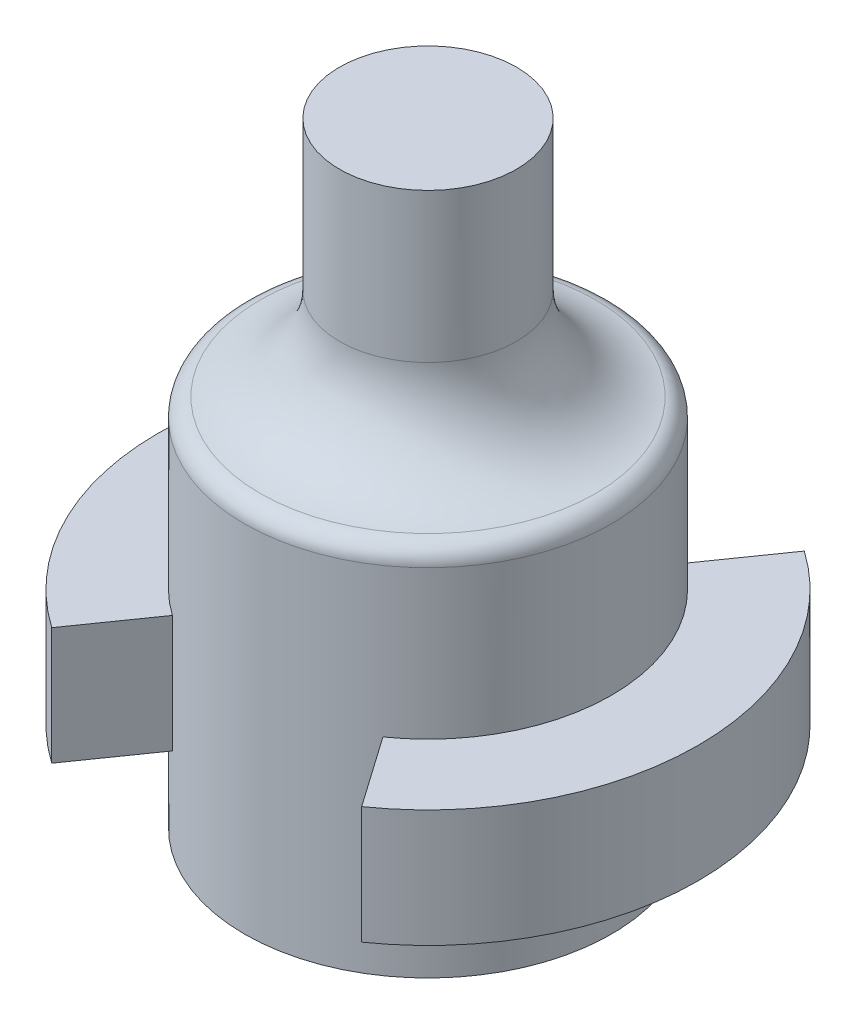
ISO-10303-21;
HEADER;
FILE_DESCRIPTION(('STEP AP214'),'2;1');
FILE_NAME('part.step','',(''),(''),'','','');
FILE_SCHEMA(('AUTOMOTIVE_DESIGN { 1 0 10303 214 1 1 1 1 }'));
ENDSEC;
DATA;
#1=APPLICATION_CONTEXT('core data for automotive mechanical design processes');
#2=APPLICATION_PROTOCOL_DEFINITION('international standard','automotive_design',2000,#1);
#3=PRODUCT_CONTEXT('',#1,'mechanical');
#4=PRODUCT('Part','Part','',(#3));
#5=PRODUCT_RELATED_PRODUCT_CATEGORY('part','',(#4));
#6=PRODUCT_DEFINITION_FORMATION('','',#4);
#7=PRODUCT_DEFINITION_CONTEXT('part definition',#1,'design');
#8=PRODUCT_DEFINITION('design','',#6,#7);
#9=PRODUCT_DEFINITION_SHAPE('','',#8);
#10=(LENGTH_UNIT() NAMED_UNIT(*) SI_UNIT(.MILLI.,.METRE.));
#11=(NAMED_UNIT(*) PLANE_ANGLE_UNIT() SI_UNIT($,.RADIAN.));
#12=(NAMED_UNIT(*) SI_UNIT($,.STERADIAN.) SOLID_ANGLE_UNIT());
#13=UNCERTAINTY_MEASURE_WITH_UNIT(LENGTH_MEASURE(1.E-05),#10,'distance_accuracy_value','');
#14=(GEOMETRIC_REPRESENTATION_CONTEXT(3) GLOBAL_UNCERTAINTY_ASSIGNED_CONTEXT((#13)) GLOBAL_UNIT_ASSIGNED_CONTEXT((#10,
#11,#12)) REPRESENTATION_CONTEXT('',''));
#15=CARTESIAN_POINT('',(0.,0.,0.));
#16=DIRECTION('',(0.,0.,1.));
#17=DIRECTION('',(1.,0.,0.));
#18=AXIS2_PLACEMENT_3D('',#15,#16,#17);
#19=CARTESIAN_POINT('',(0.,3.55,0.));
#20=DIRECTION('',(-0.819152044288995,0.,0.573576436351042));
#21=DIRECTION('',(0.573576436351042,0.,0.819152044288995));
#22=AXIS2_PLACEMENT_3D('',#19,#20,#21);
#23=PLANE('',#22);
#24=DIRECTION('',(-0.573576436351042,0.,-0.819152044288995));
#25=VECTOR('',#24,1.);
#26=CARTESIAN_POINT('',(0.,0.4,0.));
#27=LINE('',#26,#25);
#28=CARTESIAN_POINT('',(-2.82486394902888,0.4,-4.0343238181233));
#29=VERTEX_POINT('',#28);
#30=CARTESIAN_POINT('',(-4.15842916354505,0.4,-5.93885232109521));
#31=VERTEX_POINT('',#30);
#32=EDGE_CURVE('E126',#29,#31,#27,.T.);
#33=ORIENTED_EDGE('',*,*,#32,.T.);
#34=DIRECTION('',(0.,-1.,0.));
#35=VECTOR('',#34,1.);
#36=CARTESIAN_POINT('',(-4.15842916354505,3.55,-5.93885232109521));
#37=LINE('',#36,#35);
#38=CARTESIAN_POINT('',(-4.15842916354505,3.55,-5.93885232109521));
#39=VERTEX_POINT('',#38);
#40=EDGE_CURVE('E160',#39,#31,#37,.T.);
#41=ORIENTED_EDGE('',*,*,#40,.F.);
#42=DIRECTION('',(-0.573576436351042,0.,-0.819152044288995));
#43=VECTOR('',#42,1.);
#44=CARTESIAN_POINT('',(0.,3.55,0.));
#45=LINE('',#44,#43);
#46=CARTESIAN_POINT('',(-2.82486394902888,3.55,-4.0343238181233));
#47=VERTEX_POINT('',#46);
#48=EDGE_CURVE('E135',#47,#39,#45,.T.);
#49=ORIENTED_EDGE('',*,*,#48,.F.);
#50=DIRECTION('',(0.,-1.,0.));
#51=VECTOR('',#50,1.);
#52=CARTESIAN_POINT('',(-2.82486394902888,3.55,-4.0343238181233));
#53=LINE('',#52,#51);
#54=EDGE_CURVE('E145',#47,#29,#53,.T.);
#55=ORIENTED_EDGE('',*,*,#54,.T.);
#56=EDGE_LOOP('',(#33,#41,#49,#55));
#57=FACE_BOUND('',#56,.T.);
#58=ADVANCED_FACE('F41',(#57),#23,.F.);
#59=CARTESIAN_POINT('',(0.,3.55,0.));
#60=DIRECTION('',(0.,-1.,0.));
#61=DIRECTION('',(0.,0.,-1.));
#62=AXIS2_PLACEMENT_3D('',#59,#60,#61);
#63=CYLINDRICAL_SURFACE('',#62,7.25);
#64=CARTESIAN_POINT('',(0.,0.4,0.));
#65=DIRECTION('',(0.,1.,0.));
#66=DIRECTION('',(0.,0.,1.));
#67=AXIS2_PLACEMENT_3D('',#64,#65,#66);
#68=CIRCLE('',#67,7.25);
#69=CARTESIAN_POINT('',(-4.15842916354509,0.4,5.93885232109518));
#70=VERTEX_POINT('',#69);
#71=EDGE_CURVE('E129',#31,#70,#68,.T.);
#72=ORIENTED_EDGE('',*,*,#71,.T.);
#73=DIRECTION('',(0.,-1.,0.));
#74=VECTOR('',#73,1.);
#75=CARTESIAN_POINT('',(-4.15842916354509,3.55,5.93885232109518));
#76=LINE('',#75,#74);
#77=CARTESIAN_POINT('',(-4.15842916354509,3.55,5.93885232109518));
#78=VERTEX_POINT('',#77);
#79=EDGE_CURVE('E158',#78,#70,#76,.T.);
#80=ORIENTED_EDGE('',*,*,#79,.F.);
#81=CARTESIAN_POINT('',(0.,3.55,0.));
#82=DIRECTION('',(0.,1.,0.));
#83=DIRECTION('',(0.,0.,1.));
#84=AXIS2_PLACEMENT_3D('',#81,#82,#83);
#85=CIRCLE('',#84,7.25);
#86=EDGE_CURVE('E138',#39,#78,#85,.T.);
#87=ORIENTED_EDGE('',*,*,#86,.F.);
#88=ORIENTED_EDGE('',*,*,#40,.T.);
#89=EDGE_LOOP('',(#72,#80,#87,#88));
#90=FACE_BOUND('',#89,.T.);
#91=ADVANCED_FACE('F179',(#90),#63,.T.);
#92=CARTESIAN_POINT('',(0.,3.55,0.));
#93=DIRECTION('',(0.819152044288991,0.,0.573576436351047));
#94=DIRECTION('',(0.573576436351047,0.,-0.819152044288991));
#95=AXIS2_PLACEMENT_3D('',#92,#93,#94);
#96=PLANE('',#95);
#97=DIRECTION('',(-0.573576436351047,0.,0.819152044288991));
#98=VECTOR('',#97,1.);
#99=CARTESIAN_POINT('',(0.,0.4,0.));
#100=LINE('',#99,#98);
#101=CARTESIAN_POINT('',(-2.82486394902891,0.4,4.03432381812328));
#102=VERTEX_POINT('',#101);
#103=EDGE_CURVE('E149',#102,#70,#100,.T.);
#104=ORIENTED_EDGE('',*,*,#103,.F.);
#105=DIRECTION('',(0.,-1.,0.));
#106=VECTOR('',#105,1.);
#107=CARTESIAN_POINT('',(-2.82486394902891,3.55,4.03432381812328));
#108=LINE('',#107,#106);
#109=CARTESIAN_POINT('',(-2.82486394902891,3.55,4.03432381812328));
#110=VERTEX_POINT('',#109);
#111=EDGE_CURVE('E156',#110,#102,#108,.T.);
#112=ORIENTED_EDGE('',*,*,#111,.F.);
#113=DIRECTION('',(-0.573576436351047,0.,0.819152044288991));
#114=VECTOR('',#113,1.);
#115=CARTESIAN_POINT('',(0.,3.55,0.));
#116=LINE('',#115,#114);
#117=EDGE_CURVE('E141',#110,#78,#116,.T.);
#118=ORIENTED_EDGE('',*,*,#117,.T.);
#119=ORIENTED_EDGE('',*,*,#79,.T.);
#120=EDGE_LOOP('',(#104,#112,#118,#119));
#121=FACE_BOUND('',#120,.T.);
#122=ADVANCED_FACE('F186',(#121),#96,.T.);
#123=CARTESIAN_POINT('',(0.,3.55,0.));
#124=DIRECTION('',(0.,1.,0.));
#125=DIRECTION('',(0.,0.,1.));
#126=AXIS2_PLACEMENT_3D('',#123,#124,#125);
#127=PLANE('',#126);
#128=ORIENTED_EDGE('',*,*,#48,.T.);
#129=ORIENTED_EDGE('',*,*,#86,.T.);
#130=ORIENTED_EDGE('',*,*,#117,.F.);
#131=CARTESIAN_POINT('',(0.,3.55,0.));
#132=DIRECTION('',(0.,1.,0.));
#133=DIRECTION('',(0.,0.,1.));
#134=AXIS2_PLACEMENT_3D('',#131,#132,#133);
#135=CIRCLE('',#134,4.925);
#136=EDGE_CURVE('E144',#47,#110,#135,.T.);
#137=ORIENTED_EDGE('',*,*,#136,.F.);
#138=EDGE_LOOP('',(#128,#129,#130,#137));
#139=FACE_BOUND('',#138,.T.);
#140=ADVANCED_FACE('F191',(#139),#127,.T.);
#141=CARTESIAN_POINT('',(0.,0.4,0.));
#142=DIRECTION('',(0.,1.,0.));
#143=DIRECTION('',(0.,0.,1.));
#144=AXIS2_PLACEMENT_3D('',#141,#142,#143);
#145=PLANE('',#144);
#146=ORIENTED_EDGE('',*,*,#32,.F.);
#147=CARTESIAN_POINT('',(0.,0.4,0.));
#148=DIRECTION('',(0.,1.,0.));
#149=DIRECTION('',(0.,0.,1.));
#150=AXIS2_PLACEMENT_3D('',#147,#148,#149);
#151=CIRCLE('',#150,4.925);
#152=EDGE_CURVE('E139',#29,#102,#151,.T.);
#153=ORIENTED_EDGE('',*,*,#152,.T.);
#154=ORIENTED_EDGE('',*,*,#103,.T.);
#155=ORIENTED_EDGE('',*,*,#71,.F.);
#156=EDGE_LOOP('',(#146,#153,#154,#155));
#157=FACE_BOUND('',#156,.T.);
#158=ADVANCED_FACE('F193',(#157),#145,.F.);
#159=CARTESIAN_POINT('',(0.,8.,0.));
#160=DIRECTION('',(0.,-1.,0.));
#161=DIRECTION('',(0.,0.,-1.));
#162=AXIS2_PLACEMENT_3D('',#159,#160,#161);
#163=CYLINDRICAL_SURFACE('',#162,4.925);
#164=CARTESIAN_POINT('',(0.,7.53394201000722,0.));
#165=DIRECTION('',(0.,-1.,0.));
#166=DIRECTION('',(0.,0.,-1.));
#167=AXIS2_PLACEMENT_3D('',#164,#165,#166);
#168=CIRCLE('',#167,4.925);
#169=CARTESIAN_POINT('',(0.,7.53394201000722,-4.925));
#170=VERTEX_POINT('',#169);
#171=EDGE_CURVE('E11',#170,#170,#168,.T.);
#172=ORIENTED_EDGE('',*,*,#171,.T.);
#173=EDGE_LOOP('',(#172));
#174=FACE_BOUND('',#173,.T.);
#175=DIRECTION('',(0.,-1.,0.));
#176=VECTOR('',#175,1.);
#177=CARTESIAN_POINT('',(2.82486394902891,3.55,4.03432381812328));
#178=LINE('',#177,#176);
#179=CARTESIAN_POINT('',(2.82486394902891,3.55,4.03432381812328));
#180=VERTEX_POINT('',#179);
#181=CARTESIAN_POINT('',(2.82486394902891,0.4,4.03432381812328));
#182=VERTEX_POINT('',#181);
#183=EDGE_CURVE('E56',#180,#182,#178,.T.);
#184=ORIENTED_EDGE('',*,*,#183,.F.);
#185=CARTESIAN_POINT('',(0.,3.55,0.));
#186=DIRECTION('',(0.,1.,0.));
#187=DIRECTION('',(0.,0.,1.));
#188=AXIS2_PLACEMENT_3D('',#185,#186,#187);
#189=CIRCLE('',#188,4.925);
#190=CARTESIAN_POINT('',(2.82486394902888,3.55,-4.0343238181233));
#191=VERTEX_POINT('',#190);
#192=EDGE_CURVE('E61',#180,#191,#189,.T.);
#193=ORIENTED_EDGE('',*,*,#192,.T.);
#194=DIRECTION('',(0.,-1.,0.));
#195=VECTOR('',#194,1.);
#196=CARTESIAN_POINT('',(2.82486394902888,3.55,-4.0343238181233));
#197=LINE('',#196,#195);
#198=CARTESIAN_POINT('',(2.82486394902888,0.4,-4.0343238181233));
#199=VERTEX_POINT('',#198);
#200=EDGE_CURVE('E131',#191,#199,#197,.T.);
#201=ORIENTED_EDGE('',*,*,#200,.T.);
#202=CARTESIAN_POINT('',(0.,0.4,0.));
#203=DIRECTION('',(0.,1.,0.));
#204=DIRECTION('',(0.,0.,1.));
#205=AXIS2_PLACEMENT_3D('',#202,#203,#204);
#206=CIRCLE('',#205,4.925);
#207=EDGE_CURVE('E121',#182,#199,#206,.T.);
#208=ORIENTED_EDGE('',*,*,#207,.F.);
#209=EDGE_LOOP('',(#184,#193,#201,#208));
#210=FACE_BOUND('',#209,.T.);
#211=ORIENTED_EDGE('',*,*,#136,.T.);
#212=ORIENTED_EDGE('',*,*,#111,.T.);
#213=ORIENTED_EDGE('',*,*,#152,.F.);
#214=ORIENTED_EDGE('',*,*,#54,.F.);
#215=EDGE_LOOP('',(#211,#212,#213,#214));
#216=FACE_BOUND('',#215,.T.);
#217=CARTESIAN_POINT('',(0.,-2.,0.));
#218=DIRECTION('',(0.,1.,0.));
#219=DIRECTION('',(0.,0.,1.));
#220=AXIS2_PLACEMENT_3D('',#217,#218,#219);
#221=CIRCLE('',#220,4.925);
#222=CARTESIAN_POINT('',(0.,-2.,4.925));
#223=VERTEX_POINT('',#222);
#224=EDGE_CURVE('E234',#223,#223,#221,.T.);
#225=ORIENTED_EDGE('',*,*,#224,.T.);
#226=EDGE_LOOP('',(#225));
#227=FACE_BOUND('',#226,.T.);
#228=ADVANCED_FACE('F196',(#174,#210,#216,#227),#163,.T.);
#229=CARTESIAN_POINT('',(0.,3.55,0.));
#230=DIRECTION('',(0.819152044288991,0.,-0.573576436351047));
#231=DIRECTION('',(-0.573576436351047,0.,-0.819152044288991));
#232=AXIS2_PLACEMENT_3D('',#229,#230,#231);
#233=PLANE('',#232);
#234=DIRECTION('',(0.573576436351047,0.,0.819152044288991));
#235=VECTOR('',#234,1.);
#236=CARTESIAN_POINT('',(0.,0.4,0.));
#237=LINE('',#236,#235);
#238=CARTESIAN_POINT('',(4.1584291635451,0.4,5.93885232109518));
#239=VERTEX_POINT('',#238);
#240=EDGE_CURVE('E125',#182,#239,#237,.T.);
#241=ORIENTED_EDGE('',*,*,#240,.T.);
#242=DIRECTION('',(0.,-1.,0.));
#243=VECTOR('',#242,1.);
#244=CARTESIAN_POINT('',(4.1584291635451,3.55,5.93885232109518));
#245=LINE('',#244,#243);
#246=CARTESIAN_POINT('',(4.1584291635451,3.55,5.93885232109518));
#247=VERTEX_POINT('',#246);
#248=EDGE_CURVE('E110',#247,#239,#245,.T.);
#249=ORIENTED_EDGE('',*,*,#248,.F.);
#250=DIRECTION('',(0.573576436351047,0.,0.819152044288991));
#251=VECTOR('',#250,1.);
#252=CARTESIAN_POINT('',(0.,3.55,0.));
#253=LINE('',#252,#251);
#254=EDGE_CURVE('E117',#180,#247,#253,.T.);
#255=ORIENTED_EDGE('',*,*,#254,.F.);
#256=ORIENTED_EDGE('',*,*,#183,.T.);
#257=EDGE_LOOP('',(#241,#249,#255,#256));
#258=FACE_BOUND('',#257,.T.);
#259=ADVANCED_FACE('F123',(#258),#233,.F.);
#260=CARTESIAN_POINT('',(0.,3.55,0.));
#261=DIRECTION('',(0.,-1.,0.));
#262=DIRECTION('',(0.,0.,-1.));
#263=AXIS2_PLACEMENT_3D('',#260,#261,#262);
#264=CYLINDRICAL_SURFACE('',#263,7.25);
#265=CARTESIAN_POINT('',(0.,0.4,0.));
#266=DIRECTION('',(0.,1.,0.));
#267=DIRECTION('',(0.,0.,1.));
#268=AXIS2_PLACEMENT_3D('',#265,#266,#267);
#269=CIRCLE('',#268,7.25);
#270=CARTESIAN_POINT('',(4.15842916354505,0.4,-5.93885232109521));
#271=VERTEX_POINT('',#270);
#272=EDGE_CURVE('E242',#239,#271,#269,.T.);
#273=ORIENTED_EDGE('',*,*,#272,.T.);
#274=DIRECTION('',(0.,-1.,0.));
#275=VECTOR('',#274,1.);
#276=CARTESIAN_POINT('',(4.15842916354505,3.55,-5.93885232109521));
#277=LINE('',#276,#275);
#278=CARTESIAN_POINT('',(4.15842916354505,3.55,-5.93885232109521));
#279=VERTEX_POINT('',#278);
#280=EDGE_CURVE('E112',#279,#271,#277,.T.);
#281=ORIENTED_EDGE('',*,*,#280,.F.);
#282=CARTESIAN_POINT('',(0.,3.55,0.));
#283=DIRECTION('',(0.,1.,0.));
#284=DIRECTION('',(0.,0.,1.));
#285=AXIS2_PLACEMENT_3D('',#282,#283,#284);
#286=CIRCLE('',#285,7.25);
#287=EDGE_CURVE('E105',#247,#279,#286,.T.);
#288=ORIENTED_EDGE('',*,*,#287,.F.);
#289=ORIENTED_EDGE('',*,*,#248,.T.);
#290=EDGE_LOOP('',(#273,#281,#288,#289));
#291=FACE_BOUND('',#290,.T.);
#292=ADVANCED_FACE('F108',(#291),#264,.T.);
#293=CARTESIAN_POINT('',(0.,3.55,0.));
#294=DIRECTION('',(-0.819152044288995,0.,-0.573576436351042));
#295=DIRECTION('',(-0.573576436351042,0.,0.819152044288995));
#296=AXIS2_PLACEMENT_3D('',#293,#294,#295);
#297=PLANE('',#296);
#298=DIRECTION('',(0.573576436351042,0.,-0.819152044288995));
#299=VECTOR('',#298,1.);
#300=CARTESIAN_POINT('',(0.,0.4,0.));
#301=LINE('',#300,#299);
#302=EDGE_CURVE('E244',#199,#271,#301,.T.);
#303=ORIENTED_EDGE('',*,*,#302,.F.);
#304=ORIENTED_EDGE('',*,*,#200,.F.);
#305=DIRECTION('',(0.573576436351042,0.,-0.819152044288995));
#306=VECTOR('',#305,1.);
#307=CARTESIAN_POINT('',(0.,3.55,0.));
#308=LINE('',#307,#306);
#309=EDGE_CURVE('E116',#191,#279,#308,.T.);
#310=ORIENTED_EDGE('',*,*,#309,.T.);
#311=ORIENTED_EDGE('',*,*,#280,.T.);
#312=EDGE_LOOP('',(#303,#304,#310,#311));
#313=FACE_BOUND('',#312,.T.);
#314=ADVANCED_FACE('F208',(#313),#297,.T.);
#315=CARTESIAN_POINT('',(0.,3.55,0.));
#316=DIRECTION('',(0.,1.,0.));
#317=DIRECTION('',(0.,0.,1.));
#318=AXIS2_PLACEMENT_3D('',#315,#316,#317);
#319=PLANE('',#318);
#320=ORIENTED_EDGE('',*,*,#254,.T.);
#321=ORIENTED_EDGE('',*,*,#287,.T.);
#322=ORIENTED_EDGE('',*,*,#309,.F.);
#323=ORIENTED_EDGE('',*,*,#192,.F.);
#324=EDGE_LOOP('',(#320,#321,#322,#323));
#325=FACE_BOUND('',#324,.T.);
#326=ADVANCED_FACE('F119',(#325),#319,.T.);
#327=CARTESIAN_POINT('',(0.,0.4,0.));
#328=DIRECTION('',(0.,1.,0.));
#329=DIRECTION('',(0.,0.,1.));
#330=AXIS2_PLACEMENT_3D('',#327,#328,#329);
#331=PLANE('',#330);
#332=ORIENTED_EDGE('',*,*,#240,.F.);
#333=ORIENTED_EDGE('',*,*,#207,.T.);
#334=ORIENTED_EDGE('',*,*,#302,.T.);
#335=ORIENTED_EDGE('',*,*,#272,.F.);
#336=EDGE_LOOP('',(#332,#333,#334,#335));
#337=FACE_BOUND('',#336,.T.);
#338=ADVANCED_FACE('F212',(#337),#331,.F.);
#339=CARTESIAN_POINT('',(0.,-2.,0.));
#340=DIRECTION('',(0.,1.,0.));
#341=DIRECTION('',(0.,0.,1.));
#342=AXIS2_PLACEMENT_3D('',#339,#340,#341);
#343=PLANE('',#342);
#344=ORIENTED_EDGE('',*,*,#224,.F.);
#345=EDGE_LOOP('',(#344));
#346=FACE_BOUND('',#345,.T.);
#347=ADVANCED_FACE('F215',(#346),#343,.F.);
#348=CARTESIAN_POINT('',(0.,14.5,0.));
#349=DIRECTION('',(0.,-1.,0.));
#350=DIRECTION('',(0.,0.,-1.));
#351=AXIS2_PLACEMENT_3D('',#348,#349,#350);
#352=CYLINDRICAL_SURFACE('',#351,2.375);
#353=CARTESIAN_POINT('',(0.,10.5,0.));
#354=DIRECTION('',(0.,1.,0.));
#355=DIRECTION('',(0.,0.,1.));
#356=AXIS2_PLACEMENT_3D('',#353,#354,#355);
#357=CIRCLE('',#356,2.375);
#358=CARTESIAN_POINT('',(0.,10.5,-2.375));
#359=VERTEX_POINT('',#358);
#360=EDGE_CURVE('E163',#359,#359,#357,.T.);
#361=CARTESIAN_POINT('',(0.,14.5,0.));
#362=DIRECTION('',(0.,1.,0.));
#363=DIRECTION('',(0.,0.,1.));
#364=AXIS2_PLACEMENT_3D('',#361,#362,#363);
#365=CIRCLE('',#364,2.375);
#366=CARTESIAN_POINT('',(0.,14.5,-2.375));
#367=VERTEX_POINT('',#366);
#368=EDGE_CURVE('E232',#367,#367,#365,.T.);
#369=CARTESIAN_POINT('',(0.,10.5,-2.375));
#370=CARTESIAN_POINT('',(0.,10.5416666666667,-2.375));
#371=CARTESIAN_POINT('',(0.,10.5833333333333,-2.375));
#372=CARTESIAN_POINT('',(0.,10.6666666666667,-2.375));
#373=CARTESIAN_POINT('',(0.,10.7083333333333,-2.375));
#374=CARTESIAN_POINT('',(0.,10.7916666666667,-2.375));
#375=CARTESIAN_POINT('',(0.,10.8333333333333,-2.375));
#376=CARTESIAN_POINT('',(0.,10.9166666666667,-2.375));
#377=CARTESIAN_POINT('',(0.,10.9583333333333,-2.375));
#378=CARTESIAN_POINT('',(0.,11.0416666666667,-2.375));
#379=CARTESIAN_POINT('',(0.,11.0833333333333,-2.375));
#380=CARTESIAN_POINT('',(0.,11.1666666666667,-2.375));
#381=CARTESIAN_POINT('',(0.,11.2083333333333,-2.375));
#382=CARTESIAN_POINT('',(0.,11.2916666666667,-2.375));
#383=CARTESIAN_POINT('',(0.,11.3333333333333,-2.375));
#384=CARTESIAN_POINT('',(0.,11.4166666666667,-2.375));
#385=CARTESIAN_POINT('',(0.,11.4583333333333,-2.375));
#386=CARTESIAN_POINT('',(0.,11.5416666666667,-2.375));
#387=CARTESIAN_POINT('',(0.,11.5833333333333,-2.375));
#388=CARTESIAN_POINT('',(0.,11.6666666666667,-2.375));
#389=CARTESIAN_POINT('',(0.,11.7083333333333,-2.375));
#390=CARTESIAN_POINT('',(0.,11.7916666666667,-2.375));
#391=CARTESIAN_POINT('',(0.,11.8333333333333,-2.375));
#392=CARTESIAN_POINT('',(0.,11.9166666666667,-2.375));
#393=CARTESIAN_POINT('',(0.,11.9583333333333,-2.375));
#394=CARTESIAN_POINT('',(0.,12.0416666666667,-2.375));
#395=CARTESIAN_POINT('',(0.,12.0833333333333,-2.375));
#396=CARTESIAN_POINT('',(0.,12.1666666666667,-2.375));
#397=CARTESIAN_POINT('',(0.,12.2083333333333,-2.375));
#398=CARTESIAN_POINT('',(0.,12.2916666666667,-2.375));
#399=CARTESIAN_POINT('',(0.,12.3333333333333,-2.375));
#400=CARTESIAN_POINT('',(0.,12.4166666666667,-2.375));
#401=CARTESIAN_POINT('',(0.,12.4583333333333,-2.375));
#402=CARTESIAN_POINT('',(0.,12.5416666666667,-2.375));
#403=CARTESIAN_POINT('',(0.,12.5833333333333,-2.375));
#404=CARTESIAN_POINT('',(0.,12.6666666666667,-2.375));
#405=CARTESIAN_POINT('',(0.,12.7083333333333,-2.375));
#406=CARTESIAN_POINT('',(0.,12.7916666666667,-2.375));
#407=CARTESIAN_POINT('',(0.,12.8333333333333,-2.375));
#408=CARTESIAN_POINT('',(0.,12.9166666666667,-2.375));
#409=CARTESIAN_POINT('',(0.,12.9583333333333,-2.375));
#410=CARTESIAN_POINT('',(0.,13.0416666666667,-2.375));
#411=CARTESIAN_POINT('',(0.,13.0833333333333,-2.375));
#412=CARTESIAN_POINT('',(0.,13.1666666666667,-2.375));
#413=CARTESIAN_POINT('',(0.,13.2083333333333,-2.375));
#414=CARTESIAN_POINT('',(0.,13.2916666666667,-2.375));
#415=CARTESIAN_POINT('',(0.,13.3333333333333,-2.375));
#416=CARTESIAN_POINT('',(0.,13.4166666666667,-2.375));
#417=CARTESIAN_POINT('',(0.,13.4583333333333,-2.375));
#418=CARTESIAN_POINT('',(0.,13.5416666666667,-2.375));
#419=CARTESIAN_POINT('',(0.,13.5833333333333,-2.375));
#420=CARTESIAN_POINT('',(0.,13.6666666666667,-2.375));
#421=CARTESIAN_POINT('',(0.,13.7083333333333,-2.375));
#422=CARTESIAN_POINT('',(0.,13.7916666666667,-2.375));
#423=CARTESIAN_POINT('',(0.,13.8333333333333,-2.375));
#424=CARTESIAN_POINT('',(0.,13.9166666666667,-2.375));
#425=CARTESIAN_POINT('',(0.,13.9583333333333,-2.375));
#426=CARTESIAN_POINT('',(0.,14.0416666666667,-2.375));
#427=CARTESIAN_POINT('',(0.,14.0833333333333,-2.375));
#428=CARTESIAN_POINT('',(0.,14.1666666666667,-2.375));
#429=CARTESIAN_POINT('',(0.,14.2083333333333,-2.375));
#430=CARTESIAN_POINT('',(0.,14.2916666666667,-2.375));
#431=CARTESIAN_POINT('',(0.,14.3333333333333,-2.375));
#432=CARTESIAN_POINT('',(0.,14.4166666666667,-2.375));
#433=CARTESIAN_POINT('',(0.,14.4583333333333,-2.375));
#434=CARTESIAN_POINT('',(0.,14.5,-2.375));
#435=B_SPLINE_CURVE_WITH_KNOTS('',3,(#369,#370,#371,#372,#373,#374,#375,#376,#377,#378,#379,
#380,#381,#382,#383,#384,#385,#386,#387,#388,#389,#390,#391,#392,#393,#394,#395,#396,#397,#398,
#399,#400,#401,#402,#403,#404,#405,#406,#407,#408,#409,#410,#411,#412,#413,#414,#415,#416,#417,
#418,#419,#420,#421,#422,#423,#424,#425,#426,#427,#428,#429,#430,#431,#432,#433,#434),
.UNSPECIFIED.,.F.,.F.,(4,2,2,2,2,2,2,2,2,2,2,2,2,2,2,2,2,2,2,2,2,2,2,2,2,2,2,2,2,2,2,2,4),(0.,
0.124999999999998,0.249999999999999,0.374999999999999,0.499999999999999,0.624999999999999,
0.749999999999999,0.874999999999997,0.999999999999997,1.125,1.25,1.375,1.5,1.625,1.75,1.875,2.,
2.125,2.25,2.375,2.5,2.625,2.75,2.875,3.,3.125,3.25,3.375,3.5,3.625,3.75,3.875,4.),.UNSPECIFIED.);
#436=EDGE_CURVE('BSEAM221',#359,#367,#435,.T.);
#437=ORIENTED_EDGE('',*,*,#360,.T.);
#438=ORIENTED_EDGE('',*,*,#368,.F.);
#439=ORIENTED_EDGE('',*,*,#436,.T.);
#440=ORIENTED_EDGE('',*,*,#436,.F.);
#441=EDGE_LOOP('',(#437,#439,#438,#440));
#442=FACE_BOUND('',#441,.T.);
#443=ADVANCED_FACE('F221',(#442),#352,.T.);
#444=CARTESIAN_POINT('',(0.,14.5,0.));
#445=DIRECTION('',(0.,1.,0.));
#446=DIRECTION('',(0.,0.,1.));
#447=AXIS2_PLACEMENT_3D('',#444,#445,#446);
#448=PLANE('',#447);
#449=ORIENTED_EDGE('',*,*,#368,.T.);
#450=EDGE_LOOP('',(#449));
#451=FACE_BOUND('',#450,.T.);
#452=ADVANCED_FACE('F176',(#451),#448,.T.);
#453=CARTESIAN_POINT('',(0.,10.5,0.));
#454=DIRECTION('',(0.,1.,0.));
#455=DIRECTION('',(0.,0.,1.));
#456=AXIS2_PLACEMENT_3D('',#453,#454,#455);
#457=TOROIDAL_SURFACE('',#456,4.875,2.5);
#458=CARTESIAN_POINT('',(0.,8.02828500833931,0.));
#459=DIRECTION('',(0.,1.,0.));
#460=DIRECTION('',(0.,0.,1.));
#461=AXIS2_PLACEMENT_3D('',#458,#459,#460);
#462=CIRCLE('',#461,4.49999999999999);
#463=CARTESIAN_POINT('',(0.,8.02828500833931,4.49999999999999));
#464=VERTEX_POINT('',#463);
#465=EDGE_CURVE('E49',#464,#464,#462,.T.);
#466=ORIENTED_EDGE('',*,*,#465,.T.);
#467=EDGE_LOOP('',(#466));
#468=FACE_BOUND('',#467,.T.);
#469=ORIENTED_EDGE('',*,*,#360,.F.);
#470=EDGE_LOOP('',(#469));
#471=FACE_BOUND('',#470,.T.);
#472=ADVANCED_FACE('F168',(#468,#471),#457,.F.);
#473=CARTESIAN_POINT('',(0.,7.53394201000722,0.));
#474=DIRECTION('',(0.,-1.,0.));
#475=DIRECTION('',(0.,0.,-1.));
#476=AXIS2_PLACEMENT_3D('',#473,#474,#475);
#477=TOROIDAL_SURFACE('',#476,4.425,0.5);
#478=ORIENTED_EDGE('',*,*,#171,.F.);
#479=EDGE_LOOP('',(#478));
#480=FACE_BOUND('',#479,.T.);
#481=ORIENTED_EDGE('',*,*,#465,.F.);
#482=EDGE_LOOP('',(#481));
#483=FACE_BOUND('',#482,.T.);
#484=ADVANCED_FACE('F43',(#480,#483),#477,.T.);
#485=CLOSED_SHELL('',(#58,#91,#122,#140,#158,#228,#259,#292,#314,#326,#338,#347,#443,#452,#472,#484));
#486=MANIFOLD_SOLID_BREP('B2',#485);
#487=ADVANCED_BREP_SHAPE_REPRESENTATION('',(#18,#486),#14);
#488=SHAPE_DEFINITION_REPRESENTATION(#9,#487);
ENDSEC;
END-ISO-10303-21;
